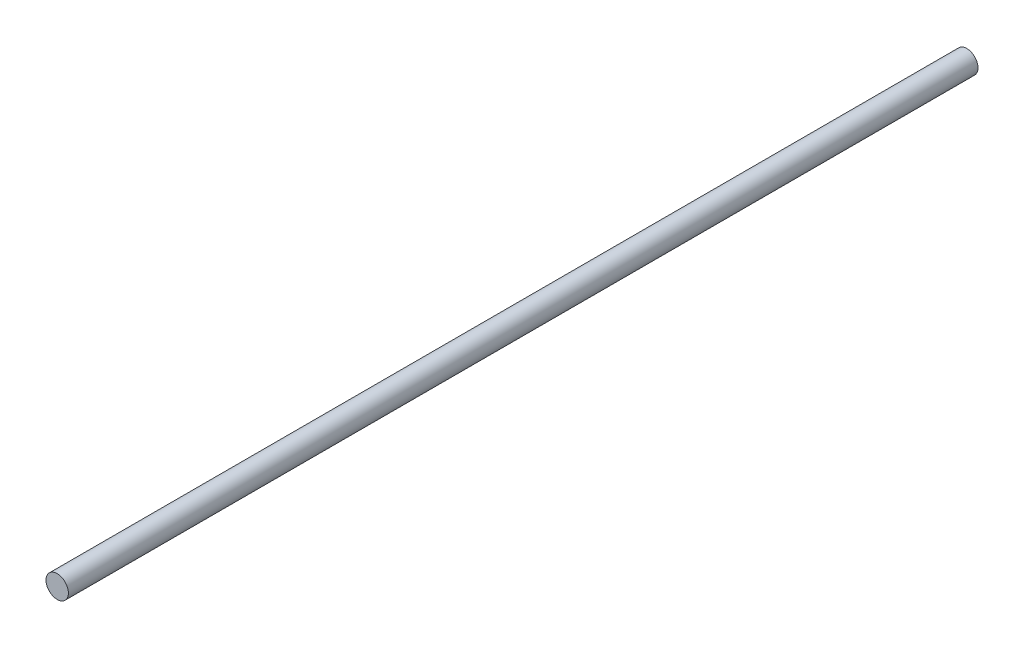
ISO-10303-21;
HEADER;
FILE_DESCRIPTION(('STEP AP214'),'2;1');
FILE_NAME('part.step','',(''),(''),'','','');
FILE_SCHEMA(('AUTOMOTIVE_DESIGN { 1 0 10303 214 1 1 1 1 }'));
ENDSEC;
DATA;
#1=APPLICATION_CONTEXT('core data for automotive mechanical design processes');
#2=APPLICATION_PROTOCOL_DEFINITION('international standard','automotive_design',2000,#1);
#3=PRODUCT_CONTEXT('',#1,'mechanical');
#4=PRODUCT('Part','Part','',(#3));
#5=PRODUCT_RELATED_PRODUCT_CATEGORY('part','',(#4));
#6=PRODUCT_DEFINITION_FORMATION('','',#4);
#7=PRODUCT_DEFINITION_CONTEXT('part definition',#1,'design');
#8=PRODUCT_DEFINITION('design','',#6,#7);
#9=PRODUCT_DEFINITION_SHAPE('','',#8);
#10=(LENGTH_UNIT() NAMED_UNIT(*) SI_UNIT(.MILLI.,.METRE.));
#11=(NAMED_UNIT(*) PLANE_ANGLE_UNIT() SI_UNIT($,.RADIAN.));
#12=(NAMED_UNIT(*) SI_UNIT($,.STERADIAN.) SOLID_ANGLE_UNIT());
#13=UNCERTAINTY_MEASURE_WITH_UNIT(LENGTH_MEASURE(1.E-05),#10,'distance_accuracy_value','');
#14=(GEOMETRIC_REPRESENTATION_CONTEXT(3) GLOBAL_UNCERTAINTY_ASSIGNED_CONTEXT((#13)) GLOBAL_UNIT_ASSIGNED_CONTEXT((#10,
#11,#12)) REPRESENTATION_CONTEXT('',''));
#15=CARTESIAN_POINT('',(0.,0.,0.));
#16=DIRECTION('',(0.,0.,1.));
#17=DIRECTION('',(1.,0.,0.));
#18=AXIS2_PLACEMENT_3D('',#15,#16,#17);
#19=CARTESIAN_POINT('',(16.,16.,1300.));
#20=DIRECTION('',(0.,0.,-1.));
#21=DIRECTION('',(-1.,0.,0.));
#22=AXIS2_PLACEMENT_3D('',#19,#20,#21);
#23=CYLINDRICAL_SURFACE('',#22,16.);
#24=CARTESIAN_POINT('',(16.,16.,1300.));
#25=DIRECTION('',(0.,0.,1.));
#26=DIRECTION('',(1.,0.,0.));
#27=AXIS2_PLACEMENT_3D('',#24,#25,#26);
#28=CIRCLE('',#27,16.);
#29=CARTESIAN_POINT('',(32.,16.,1300.));
#30=VERTEX_POINT('',#29);
#31=EDGE_CURVE('E10',#30,#30,#28,.T.);
#32=ORIENTED_EDGE('',*,*,#31,.F.);
#33=EDGE_LOOP('',(#32));
#34=FACE_BOUND('',#33,.T.);
#35=CARTESIAN_POINT('',(16.,16.,0.));
#36=DIRECTION('',(0.,0.,1.));
#37=DIRECTION('',(1.,0.,0.));
#38=AXIS2_PLACEMENT_3D('',#35,#36,#37);
#39=CIRCLE('',#38,16.);
#40=CARTESIAN_POINT('',(32.,16.,0.));
#41=VERTEX_POINT('',#40);
#42=EDGE_CURVE('E42',#41,#41,#39,.T.);
#43=ORIENTED_EDGE('',*,*,#42,.T.);
#44=EDGE_LOOP('',(#43));
#45=FACE_BOUND('',#44,.T.);
#46=ADVANCED_FACE('F41',(#34,#45),#23,.T.);
#47=CARTESIAN_POINT('',(16.,16.,1300.));
#48=DIRECTION('',(0.,0.,1.));
#49=DIRECTION('',(1.,0.,0.));
#50=AXIS2_PLACEMENT_3D('',#47,#48,#49);
#51=PLANE('',#50);
#52=ORIENTED_EDGE('',*,*,#31,.T.);
#53=EDGE_LOOP('',(#52));
#54=FACE_BOUND('',#53,.T.);
#55=ADVANCED_FACE('F57',(#54),#51,.T.);
#56=CARTESIAN_POINT('',(16.,16.,0.));
#57=DIRECTION('',(0.,0.,1.));
#58=DIRECTION('',(1.,0.,0.));
#59=AXIS2_PLACEMENT_3D('',#56,#57,#58);
#60=PLANE('',#59);
#61=ORIENTED_EDGE('',*,*,#42,.F.);
#62=EDGE_LOOP('',(#61));
#63=FACE_BOUND('',#62,.T.);
#64=ADVANCED_FACE('F53',(#63),#60,.F.);
#65=CLOSED_SHELL('',(#46,#55,#64));
#66=MANIFOLD_SOLID_BREP('B2',#65);
#67=ADVANCED_BREP_SHAPE_REPRESENTATION('',(#18,#66),#14);
#68=SHAPE_DEFINITION_REPRESENTATION(#9,#67);
ENDSEC;
END-ISO-10303-21;
